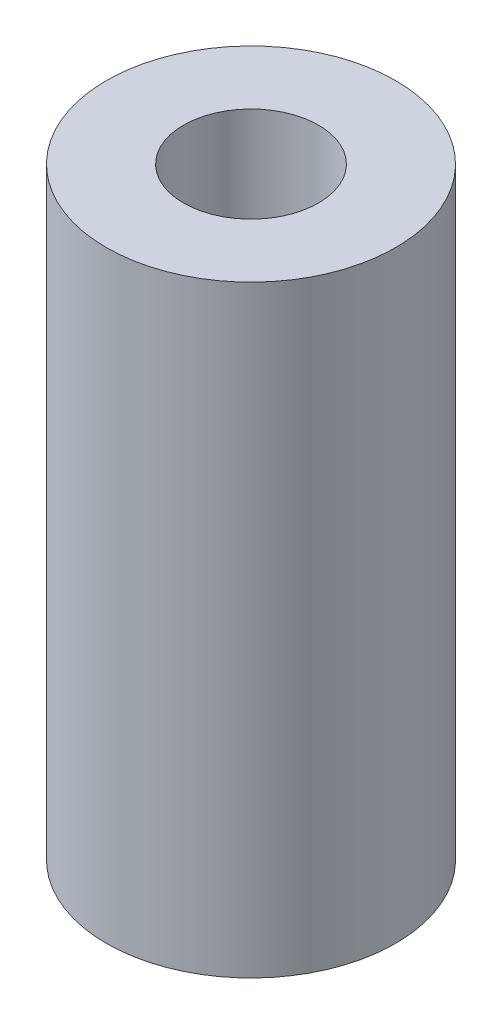
ISO-10303-21;
HEADER;
FILE_DESCRIPTION(('STEP AP214'),'2;1');
FILE_NAME('part.step','',(''),(''),'','','');
FILE_SCHEMA(('AUTOMOTIVE_DESIGN { 1 0 10303 214 1 1 1 1 }'));
ENDSEC;
DATA;
#1=APPLICATION_CONTEXT('core data for automotive mechanical design processes');
#2=APPLICATION_PROTOCOL_DEFINITION('international standard','automotive_design',2000,#1);
#3=PRODUCT_CONTEXT('',#1,'mechanical');
#4=PRODUCT('Part','Part','',(#3));
#5=PRODUCT_RELATED_PRODUCT_CATEGORY('part','',(#4));
#6=PRODUCT_DEFINITION_FORMATION('','',#4);
#7=PRODUCT_DEFINITION_CONTEXT('part definition',#1,'design');
#8=PRODUCT_DEFINITION('design','',#6,#7);
#9=PRODUCT_DEFINITION_SHAPE('','',#8);
#10=(LENGTH_UNIT() NAMED_UNIT(*) SI_UNIT(.MILLI.,.METRE.));
#11=(NAMED_UNIT(*) PLANE_ANGLE_UNIT() SI_UNIT($,.RADIAN.));
#12=(NAMED_UNIT(*) SI_UNIT($,.STERADIAN.) SOLID_ANGLE_UNIT());
#13=UNCERTAINTY_MEASURE_WITH_UNIT(LENGTH_MEASURE(1.E-05),#10,'distance_accuracy_value','');
#14=(GEOMETRIC_REPRESENTATION_CONTEXT(3) GLOBAL_UNCERTAINTY_ASSIGNED_CONTEXT((#13)) GLOBAL_UNIT_ASSIGNED_CONTEXT((#10,
#11,#12)) REPRESENTATION_CONTEXT('',''));
#15=CARTESIAN_POINT('',(0.,0.,0.));
#16=DIRECTION('',(0.,0.,1.));
#17=DIRECTION('',(1.,0.,0.));
#18=AXIS2_PLACEMENT_3D('',#15,#16,#17);
#19=CARTESIAN_POINT('',(15.9251984580936,12.5,-13.3521699124458));
#20=DIRECTION('',(0.,-1.,0.));
#21=DIRECTION('',(0.,0.,-1.));
#22=AXIS2_PLACEMENT_3D('',#19,#20,#21);
#23=CYLINDRICAL_SURFACE('',#22,3.);
#24=CARTESIAN_POINT('',(15.9251984580936,12.5,-13.3521699124458));
#25=DIRECTION('',(0.,1.,0.));
#26=DIRECTION('',(0.,0.,1.));
#27=AXIS2_PLACEMENT_3D('',#24,#25,#26);
#28=CIRCLE('',#27,3.);
#29=CARTESIAN_POINT('',(15.9251984580936,12.5,-10.3521699124458));
#30=VERTEX_POINT('',#29);
#31=EDGE_CURVE('E10',#30,#30,#28,.T.);
#32=ORIENTED_EDGE('',*,*,#31,.F.);
#33=EDGE_LOOP('',(#32));
#34=FACE_BOUND('',#33,.T.);
#35=CARTESIAN_POINT('',(15.9251984580936,0.,-13.3521699124458));
#36=DIRECTION('',(0.,1.,0.));
#37=DIRECTION('',(0.,0.,1.));
#38=AXIS2_PLACEMENT_3D('',#35,#36,#37);
#39=CIRCLE('',#38,3.);
#40=CARTESIAN_POINT('',(15.9251984580936,0.,-10.3521699124458));
#41=VERTEX_POINT('',#40);
#42=EDGE_CURVE('E42',#41,#41,#39,.T.);
#43=ORIENTED_EDGE('',*,*,#42,.T.);
#44=EDGE_LOOP('',(#43));
#45=FACE_BOUND('',#44,.T.);
#46=ADVANCED_FACE('F39',(#34,#45),#23,.T.);
#47=CARTESIAN_POINT('',(0.,12.5,0.));
#48=DIRECTION('',(0.,1.,0.));
#49=DIRECTION('',(0.,0.,1.));
#50=AXIS2_PLACEMENT_3D('',#47,#48,#49);
#51=PLANE('',#50);
#52=CARTESIAN_POINT('',(15.9251984580936,12.5,-13.3521699124458));
#53=DIRECTION('',(0.,1.,0.));
#54=DIRECTION('',(0.,0.,1.));
#55=AXIS2_PLACEMENT_3D('',#52,#53,#54);
#56=CIRCLE('',#55,1.4);
#57=CARTESIAN_POINT('',(15.9251984580936,12.5,-11.9521699124458));
#58=VERTEX_POINT('',#57);
#59=EDGE_CURVE('E51',#58,#58,#56,.T.);
#60=ORIENTED_EDGE('',*,*,#59,.F.);
#61=EDGE_LOOP('',(#60));
#62=FACE_BOUND('',#61,.T.);
#63=ORIENTED_EDGE('',*,*,#31,.T.);
#64=EDGE_LOOP('',(#63));
#65=FACE_BOUND('',#64,.T.);
#66=ADVANCED_FACE('F66',(#62,#65),#51,.T.);
#67=CARTESIAN_POINT('',(0.,0.,0.));
#68=DIRECTION('',(0.,1.,0.));
#69=DIRECTION('',(0.,0.,1.));
#70=AXIS2_PLACEMENT_3D('',#67,#68,#69);
#71=PLANE('',#70);
#72=ORIENTED_EDGE('',*,*,#42,.F.);
#73=EDGE_LOOP('',(#72));
#74=FACE_BOUND('',#73,.T.);
#75=ADVANCED_FACE('F62',(#74),#71,.F.);
#76=CARTESIAN_POINT('',(15.9251984580936,2.5,-13.3521699124458));
#77=DIRECTION('',(0.,1.,0.));
#78=DIRECTION('',(0.,0.,1.));
#79=AXIS2_PLACEMENT_3D('',#76,#77,#78);
#80=CYLINDRICAL_SURFACE('',#79,1.4);
#81=CARTESIAN_POINT('',(15.9251984580936,2.5,-13.3521699124458));
#82=DIRECTION('',(0.,1.,0.));
#83=DIRECTION('',(0.,0.,1.));
#84=AXIS2_PLACEMENT_3D('',#81,#82,#83);
#85=CIRCLE('',#84,1.4);
#86=CARTESIAN_POINT('',(15.9251984580936,2.5,-11.9521699124458));
#87=VERTEX_POINT('',#86);
#88=EDGE_CURVE('E49',#87,#87,#85,.T.);
#89=ORIENTED_EDGE('',*,*,#88,.F.);
#90=EDGE_LOOP('',(#89));
#91=FACE_BOUND('',#90,.T.);
#92=ORIENTED_EDGE('',*,*,#59,.T.);
#93=EDGE_LOOP('',(#92));
#94=FACE_BOUND('',#93,.T.);
#95=ADVANCED_FACE('F59',(#91,#94),#80,.F.);
#96=CARTESIAN_POINT('',(15.9251984580936,2.5,-13.3521699124458));
#97=DIRECTION('',(0.,1.,0.));
#98=DIRECTION('',(0.,0.,1.));
#99=AXIS2_PLACEMENT_3D('',#96,#97,#98);
#100=PLANE('',#99);
#101=ORIENTED_EDGE('',*,*,#88,.T.);
#102=EDGE_LOOP('',(#101));
#103=FACE_BOUND('',#102,.T.);
#104=ADVANCED_FACE('F57',(#103),#100,.T.);
#105=CLOSED_SHELL('',(#46,#66,#75,#95,#104));
#106=MANIFOLD_SOLID_BREP('B2',#105);
#107=ADVANCED_BREP_SHAPE_REPRESENTATION('',(#18,#106),#14);
#108=SHAPE_DEFINITION_REPRESENTATION(#9,#107);
ENDSEC;
END-ISO-10303-21;
